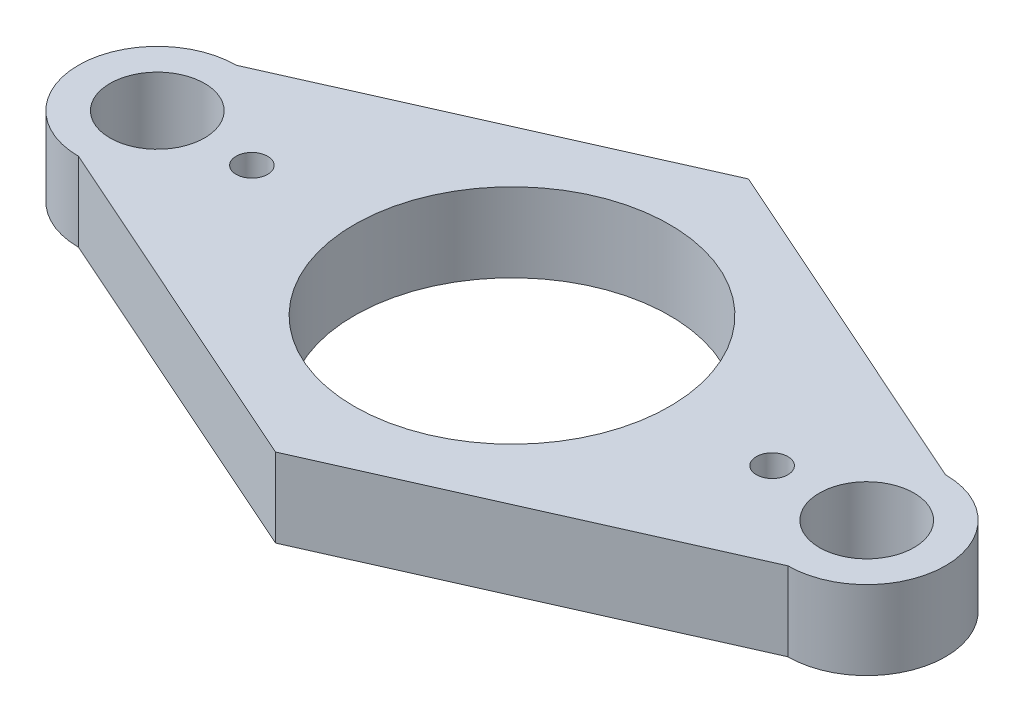
ISO-10303-21;
HEADER;
FILE_DESCRIPTION(('STEP AP214'),'2;1');
FILE_NAME('part.step','',(''),(''),'','','');
FILE_SCHEMA(('AUTOMOTIVE_DESIGN { 1 0 10303 214 1 1 1 1 }'));
ENDSEC;
DATA;
#1=APPLICATION_CONTEXT('core data for automotive mechanical design processes');
#2=APPLICATION_PROTOCOL_DEFINITION('international standard','automotive_design',2000,#1);
#3=PRODUCT_CONTEXT('',#1,'mechanical');
#4=PRODUCT('Part','Part','',(#3));
#5=PRODUCT_RELATED_PRODUCT_CATEGORY('part','',(#4));
#6=PRODUCT_DEFINITION_FORMATION('','',#4);
#7=PRODUCT_DEFINITION_CONTEXT('part definition',#1,'design');
#8=PRODUCT_DEFINITION('design','',#6,#7);
#9=PRODUCT_DEFINITION_SHAPE('','',#8);
#10=(LENGTH_UNIT() NAMED_UNIT(*) SI_UNIT(.MILLI.,.METRE.));
#11=(NAMED_UNIT(*) PLANE_ANGLE_UNIT() SI_UNIT($,.RADIAN.));
#12=(NAMED_UNIT(*) SI_UNIT($,.STERADIAN.) SOLID_ANGLE_UNIT());
#13=UNCERTAINTY_MEASURE_WITH_UNIT(LENGTH_MEASURE(1.E-05),#10,'distance_accuracy_value','');
#14=(GEOMETRIC_REPRESENTATION_CONTEXT(3) GLOBAL_UNCERTAINTY_ASSIGNED_CONTEXT((#13)) GLOBAL_UNIT_ASSIGNED_CONTEXT((#10,
#11,#12)) REPRESENTATION_CONTEXT('',''));
#15=CARTESIAN_POINT('',(0.,0.,0.));
#16=DIRECTION('',(0.,0.,1.));
#17=DIRECTION('',(1.,0.,0.));
#18=AXIS2_PLACEMENT_3D('',#15,#16,#17);
#19=CARTESIAN_POINT('',(22.5,5.,0.869271295597634));
#20=DIRECTION('',(0.,-1.,0.));
#21=DIRECTION('',(0.,0.,-1.));
#22=AXIS2_PLACEMENT_3D('',#19,#20,#21);
#23=CYLINDRICAL_SURFACE('',#22,5.);
#24=CARTESIAN_POINT('',(22.5,0.,0.869271295597634));
#25=DIRECTION('',(0.,1.,0.));
#26=DIRECTION('',(0.,0.,1.));
#27=AXIS2_PLACEMENT_3D('',#24,#25,#26);
#28=CIRCLE('',#27,5.);
#29=CARTESIAN_POINT('',(22.5,0.,-4.13072870440236));
#30=VERTEX_POINT('',#29);
#31=CARTESIAN_POINT('',(22.5,0.,5.86927129559764));
#32=VERTEX_POINT('',#31);
#33=EDGE_CURVE('E135',#30,#32,#28,.F.);
#34=ORIENTED_EDGE('',*,*,#33,.F.);
#35=DIRECTION('',(0.,-1.,0.));
#36=VECTOR('',#35,1.);
#37=CARTESIAN_POINT('',(22.5,5.,-4.13072870440236));
#38=LINE('',#37,#36);
#39=CARTESIAN_POINT('',(22.5,5.,-4.13072870440236));
#40=VERTEX_POINT('',#39);
#41=EDGE_CURVE('E11',#40,#30,#38,.T.);
#42=ORIENTED_EDGE('',*,*,#41,.F.);
#43=CARTESIAN_POINT('',(22.5,5.,0.869271295597634));
#44=DIRECTION('',(0.,1.,0.));
#45=DIRECTION('',(0.,0.,1.));
#46=AXIS2_PLACEMENT_3D('',#43,#44,#45);
#47=CIRCLE('',#46,5.);
#48=CARTESIAN_POINT('',(22.5,5.,5.86927129559764));
#49=VERTEX_POINT('',#48);
#50=EDGE_CURVE('E222',#40,#49,#47,.F.);
#51=ORIENTED_EDGE('',*,*,#50,.T.);
#52=DIRECTION('',(0.,-1.,0.));
#53=VECTOR('',#52,1.);
#54=CARTESIAN_POINT('',(22.5,5.,5.86927129559764));
#55=LINE('',#54,#53);
#56=EDGE_CURVE('E54',#49,#32,#55,.T.);
#57=ORIENTED_EDGE('',*,*,#56,.T.);
#58=EDGE_LOOP('',(#34,#42,#51,#57));
#59=FACE_BOUND('',#58,.T.);
#60=ADVANCED_FACE('F37',(#59),#23,.T.);
#61=CARTESIAN_POINT('',(5.2443941583349,5.,-11.7998868562535));
#62=DIRECTION('',(0.406138466053448,0.,-0.913811548620257));
#63=DIRECTION('',(-0.913811548620257,0.,-0.406138466053448));
#64=AXIS2_PLACEMENT_3D('',#61,#62,#63);
#65=PLANE('',#64);
#66=DIRECTION('',(0.913811548620257,0.,0.406138466053448));
#67=VECTOR('',#66,1.);
#68=CARTESIAN_POINT('',(5.2443941583349,0.,-11.7998868562535));
#69=LINE('',#68,#67);
#70=CARTESIAN_POINT('',(0.,0.,-14.1307287044024));
#71=VERTEX_POINT('',#70);
#72=EDGE_CURVE('E137',#71,#30,#69,.T.);
#73=ORIENTED_EDGE('',*,*,#72,.F.);
#74=DIRECTION('',(0.,-1.,0.));
#75=VECTOR('',#74,1.);
#76=CARTESIAN_POINT('',(0.,5.,-14.1307287044024));
#77=LINE('',#76,#75);
#78=CARTESIAN_POINT('',(0.,5.,-14.1307287044024));
#79=VERTEX_POINT('',#78);
#80=EDGE_CURVE('E46',#79,#71,#77,.T.);
#81=ORIENTED_EDGE('',*,*,#80,.F.);
#82=DIRECTION('',(0.913811548620257,0.,0.406138466053448));
#83=VECTOR('',#82,1.);
#84=CARTESIAN_POINT('',(5.2443941583349,5.,-11.7998868562535));
#85=LINE('',#84,#83);
#86=EDGE_CURVE('E224',#79,#40,#85,.T.);
#87=ORIENTED_EDGE('',*,*,#86,.T.);
#88=ORIENTED_EDGE('',*,*,#41,.T.);
#89=EDGE_LOOP('',(#73,#81,#87,#88));
#90=FACE_BOUND('',#89,.T.);
#91=ADVANCED_FACE('F167',(#90),#65,.T.);
#92=CARTESIAN_POINT('',(-5.2443941583349,5.,-11.7998868562535));
#93=DIRECTION('',(-0.406138466053447,0.,-0.913811548620257));
#94=DIRECTION('',(-0.913811548620257,0.,0.406138466053448));
#95=AXIS2_PLACEMENT_3D('',#92,#93,#94);
#96=PLANE('',#95);
#97=DIRECTION('',(0.913811548620257,0.,-0.406138466053447));
#98=VECTOR('',#97,1.);
#99=CARTESIAN_POINT('',(-5.2443941583349,0.,-11.7998868562535));
#100=LINE('',#99,#98);
#101=CARTESIAN_POINT('',(-22.5,0.,-4.13072870440236));
#102=VERTEX_POINT('',#101);
#103=EDGE_CURVE('E140',#102,#71,#100,.T.);
#104=ORIENTED_EDGE('',*,*,#103,.F.);
#105=DIRECTION('',(0.,-1.,0.));
#106=VECTOR('',#105,1.);
#107=CARTESIAN_POINT('',(-22.5,5.,-4.13072870440236));
#108=LINE('',#107,#106);
#109=CARTESIAN_POINT('',(-22.5,5.,-4.13072870440236));
#110=VERTEX_POINT('',#109);
#111=EDGE_CURVE('E112',#110,#102,#108,.T.);
#112=ORIENTED_EDGE('',*,*,#111,.F.);
#113=DIRECTION('',(0.913811548620257,0.,-0.406138466053447));
#114=VECTOR('',#113,1.);
#115=CARTESIAN_POINT('',(-5.2443941583349,5.,-11.7998868562535));
#116=LINE('',#115,#114);
#117=EDGE_CURVE('E102',#110,#79,#116,.T.);
#118=ORIENTED_EDGE('',*,*,#117,.T.);
#119=ORIENTED_EDGE('',*,*,#80,.T.);
#120=EDGE_LOOP('',(#104,#112,#118,#119));
#121=FACE_BOUND('',#120,.T.);
#122=ADVANCED_FACE('F164',(#121),#96,.T.);
#123=CARTESIAN_POINT('',(-22.5,5.,0.869271295597634));
#124=DIRECTION('',(0.,-1.,0.));
#125=DIRECTION('',(0.,0.,-1.));
#126=AXIS2_PLACEMENT_3D('',#123,#124,#125);
#127=CYLINDRICAL_SURFACE('',#126,5.);
#128=CARTESIAN_POINT('',(-22.5,0.,0.869271295597634));
#129=DIRECTION('',(0.,1.,0.));
#130=DIRECTION('',(0.,0.,1.));
#131=AXIS2_PLACEMENT_3D('',#128,#129,#130);
#132=CIRCLE('',#131,5.);
#133=CARTESIAN_POINT('',(-22.5,0.,5.86927129559763));
#134=VERTEX_POINT('',#133);
#135=EDGE_CURVE('E109',#102,#134,#132,.T.);
#136=ORIENTED_EDGE('',*,*,#135,.T.);
#137=DIRECTION('',(0.,-1.,0.));
#138=VECTOR('',#137,1.);
#139=CARTESIAN_POINT('',(-22.5,5.,5.86927129559763));
#140=LINE('',#139,#138);
#141=CARTESIAN_POINT('',(-22.5,5.,5.86927129559763));
#142=VERTEX_POINT('',#141);
#143=EDGE_CURVE('E106',#142,#134,#140,.T.);
#144=ORIENTED_EDGE('',*,*,#143,.F.);
#145=CARTESIAN_POINT('',(-22.5,5.,0.869271295597634));
#146=DIRECTION('',(0.,1.,0.));
#147=DIRECTION('',(0.,0.,1.));
#148=AXIS2_PLACEMENT_3D('',#145,#146,#147);
#149=CIRCLE('',#148,5.);
#150=EDGE_CURVE('E93',#110,#142,#149,.T.);
#151=ORIENTED_EDGE('',*,*,#150,.F.);
#152=ORIENTED_EDGE('',*,*,#111,.T.);
#153=EDGE_LOOP('',(#136,#144,#151,#152));
#154=FACE_BOUND('',#153,.T.);
#155=ADVANCED_FACE('F107',(#154),#127,.T.);
#156=CARTESIAN_POINT('',(-5.8896264602218,5.,13.251659535499));
#157=DIRECTION('',(-0.406138466053447,0.,0.913811548620257));
#158=DIRECTION('',(0.913811548620257,0.,0.406138466053448));
#159=AXIS2_PLACEMENT_3D('',#156,#157,#158);
#160=PLANE('',#159);
#161=DIRECTION('',(-0.913811548620257,0.,-0.406138466053447));
#162=VECTOR('',#161,1.);
#163=CARTESIAN_POINT('',(-5.8896264602218,0.,13.251659535499));
#164=LINE('',#163,#162);
#165=CARTESIAN_POINT('',(0.,0.,15.8692712955976));
#166=VERTEX_POINT('',#165);
#167=EDGE_CURVE('E144',#166,#134,#164,.T.);
#168=ORIENTED_EDGE('',*,*,#167,.F.);
#169=DIRECTION('',(0.,-1.,0.));
#170=VECTOR('',#169,1.);
#171=CARTESIAN_POINT('',(0.,5.,15.8692712955976));
#172=LINE('',#171,#170);
#173=CARTESIAN_POINT('',(0.,5.,15.8692712955976));
#174=VERTEX_POINT('',#173);
#175=EDGE_CURVE('E73',#174,#166,#172,.T.);
#176=ORIENTED_EDGE('',*,*,#175,.F.);
#177=DIRECTION('',(-0.913811548620257,0.,-0.406138466053447));
#178=VECTOR('',#177,1.);
#179=CARTESIAN_POINT('',(-5.8896264602218,5.,13.251659535499));
#180=LINE('',#179,#178);
#181=EDGE_CURVE('E99',#174,#142,#180,.T.);
#182=ORIENTED_EDGE('',*,*,#181,.T.);
#183=ORIENTED_EDGE('',*,*,#143,.T.);
#184=EDGE_LOOP('',(#168,#176,#182,#183));
#185=FACE_BOUND('',#184,.T.);
#186=ADVANCED_FACE('F114',(#185),#160,.T.);
#187=CARTESIAN_POINT('',(0.,5.,0.869271295597634));
#188=DIRECTION('',(0.,-1.,0.));
#189=DIRECTION('',(0.,0.,-1.));
#190=AXIS2_PLACEMENT_3D('',#187,#188,#189);
#191=CYLINDRICAL_SURFACE('',#190,10.);
#192=CARTESIAN_POINT('',(0.,5.,0.869271295597634));
#193=DIRECTION('',(0.,1.,0.));
#194=DIRECTION('',(0.,0.,1.));
#195=AXIS2_PLACEMENT_3D('',#192,#193,#194);
#196=CIRCLE('',#195,10.);
#197=CARTESIAN_POINT('',(0.,5.,10.8692712955976));
#198=VERTEX_POINT('',#197);
#199=EDGE_CURVE('E123',#198,#198,#196,.T.);
#200=ORIENTED_EDGE('',*,*,#199,.T.);
#201=EDGE_LOOP('',(#200));
#202=FACE_BOUND('',#201,.T.);
#203=CARTESIAN_POINT('',(0.,0.,0.869271295597634));
#204=DIRECTION('',(0.,1.,0.));
#205=DIRECTION('',(0.,0.,1.));
#206=AXIS2_PLACEMENT_3D('',#203,#204,#205);
#207=CIRCLE('',#206,10.);
#208=CARTESIAN_POINT('',(0.,0.,10.8692712955976));
#209=VERTEX_POINT('',#208);
#210=EDGE_CURVE('E152',#209,#209,#207,.T.);
#211=ORIENTED_EDGE('',*,*,#210,.F.);
#212=EDGE_LOOP('',(#211));
#213=FACE_BOUND('',#212,.T.);
#214=ADVANCED_FACE('F181',(#202,#213),#191,.F.);
#215=CARTESIAN_POINT('',(22.5,5.,0.869271295597634));
#216=DIRECTION('',(0.,-1.,0.));
#217=DIRECTION('',(0.,0.,-1.));
#218=AXIS2_PLACEMENT_3D('',#215,#216,#217);
#219=CYLINDRICAL_SURFACE('',#218,2.99999999999999);
#220=CARTESIAN_POINT('',(22.5,5.,0.869271295597634));
#221=DIRECTION('',(0.,1.,0.));
#222=DIRECTION('',(0.,0.,1.));
#223=AXIS2_PLACEMENT_3D('',#220,#221,#222);
#224=CIRCLE('',#223,2.99999999999999);
#225=CARTESIAN_POINT('',(22.5,5.,3.86927129559763));
#226=VERTEX_POINT('',#225);
#227=EDGE_CURVE('E117',#226,#226,#224,.T.);
#228=ORIENTED_EDGE('',*,*,#227,.T.);
#229=EDGE_LOOP('',(#228));
#230=FACE_BOUND('',#229,.T.);
#231=CARTESIAN_POINT('',(22.5,0.,0.869271295597634));
#232=DIRECTION('',(0.,1.,0.));
#233=DIRECTION('',(0.,0.,1.));
#234=AXIS2_PLACEMENT_3D('',#231,#232,#233);
#235=CIRCLE('',#234,2.99999999999999);
#236=CARTESIAN_POINT('',(22.5,0.,3.86927129559763));
#237=VERTEX_POINT('',#236);
#238=EDGE_CURVE('E149',#237,#237,#235,.T.);
#239=ORIENTED_EDGE('',*,*,#238,.F.);
#240=EDGE_LOOP('',(#239));
#241=FACE_BOUND('',#240,.T.);
#242=ADVANCED_FACE('F174',(#230,#241),#219,.F.);
#243=CARTESIAN_POINT('',(5.88962646022181,5.,13.2516595354991));
#244=DIRECTION('',(0.406138466053448,0.,0.913811548620257));
#245=DIRECTION('',(0.913811548620257,0.,-0.406138466053448));
#246=AXIS2_PLACEMENT_3D('',#243,#244,#245);
#247=PLANE('',#246);
#248=DIRECTION('',(-0.913811548620257,0.,0.406138466053448));
#249=VECTOR('',#248,1.);
#250=CARTESIAN_POINT('',(5.88962646022181,0.,13.2516595354991));
#251=LINE('',#250,#249);
#252=EDGE_CURVE('E146',#32,#166,#251,.T.);
#253=ORIENTED_EDGE('',*,*,#252,.F.);
#254=ORIENTED_EDGE('',*,*,#56,.F.);
#255=DIRECTION('',(-0.913811548620257,0.,0.406138466053448));
#256=VECTOR('',#255,1.);
#257=CARTESIAN_POINT('',(5.88962646022181,5.,13.2516595354991));
#258=LINE('',#257,#256);
#259=EDGE_CURVE('E115',#49,#174,#258,.T.);
#260=ORIENTED_EDGE('',*,*,#259,.T.);
#261=ORIENTED_EDGE('',*,*,#175,.T.);
#262=EDGE_LOOP('',(#253,#254,#260,#261));
#263=FACE_BOUND('',#262,.T.);
#264=ADVANCED_FACE('F171',(#263),#247,.T.);
#265=CARTESIAN_POINT('',(-16.5,5.,0.869271295597634));
#266=DIRECTION('',(0.,-1.,0.));
#267=DIRECTION('',(0.,0.,-1.));
#268=AXIS2_PLACEMENT_3D('',#265,#266,#267);
#269=CYLINDRICAL_SURFACE('',#268,1.);
#270=CARTESIAN_POINT('',(-16.5,5.,0.869271295597634));
#271=DIRECTION('',(0.,1.,0.));
#272=DIRECTION('',(0.,0.,1.));
#273=AXIS2_PLACEMENT_3D('',#270,#271,#272);
#274=CIRCLE('',#273,1.);
#275=CARTESIAN_POINT('',(-16.5,5.,1.86927129559764));
#276=VERTEX_POINT('',#275);
#277=EDGE_CURVE('E221',#276,#276,#274,.T.);
#278=ORIENTED_EDGE('',*,*,#277,.T.);
#279=EDGE_LOOP('',(#278));
#280=FACE_BOUND('',#279,.T.);
#281=CARTESIAN_POINT('',(-16.5,0.,0.869271295597634));
#282=DIRECTION('',(0.,1.,0.));
#283=DIRECTION('',(0.,0.,1.));
#284=AXIS2_PLACEMENT_3D('',#281,#282,#283);
#285=CIRCLE('',#284,1.);
#286=CARTESIAN_POINT('',(-16.5,0.,1.86927129559764));
#287=VERTEX_POINT('',#286);
#288=EDGE_CURVE('E132',#287,#287,#285,.T.);
#289=ORIENTED_EDGE('',*,*,#288,.F.);
#290=EDGE_LOOP('',(#289));
#291=FACE_BOUND('',#290,.T.);
#292=ADVANCED_FACE('F173',(#280,#291),#269,.F.);
#293=CARTESIAN_POINT('',(16.5,5.,0.869271295597634));
#294=DIRECTION('',(0.,-1.,0.));
#295=DIRECTION('',(0.,0.,-1.));
#296=AXIS2_PLACEMENT_3D('',#293,#294,#295);
#297=CYLINDRICAL_SURFACE('',#296,1.);
#298=CARTESIAN_POINT('',(16.5,5.,0.869271295597634));
#299=DIRECTION('',(0.,1.,0.));
#300=DIRECTION('',(0.,0.,1.));
#301=AXIS2_PLACEMENT_3D('',#298,#299,#300);
#302=CIRCLE('',#301,1.);
#303=CARTESIAN_POINT('',(16.5,5.,1.86927129559764));
#304=VERTEX_POINT('',#303);
#305=EDGE_CURVE('E158',#304,#304,#302,.T.);
#306=ORIENTED_EDGE('',*,*,#305,.T.);
#307=EDGE_LOOP('',(#306));
#308=FACE_BOUND('',#307,.T.);
#309=CARTESIAN_POINT('',(16.5,0.,0.869271295597634));
#310=DIRECTION('',(0.,1.,0.));
#311=DIRECTION('',(0.,0.,1.));
#312=AXIS2_PLACEMENT_3D('',#309,#310,#311);
#313=CIRCLE('',#312,1.);
#314=CARTESIAN_POINT('',(16.5,0.,1.86927129559764));
#315=VERTEX_POINT('',#314);
#316=EDGE_CURVE('E129',#315,#315,#313,.T.);
#317=ORIENTED_EDGE('',*,*,#316,.F.);
#318=EDGE_LOOP('',(#317));
#319=FACE_BOUND('',#318,.T.);
#320=ADVANCED_FACE('F39',(#308,#319),#297,.F.);
#321=CARTESIAN_POINT('',(-22.5,5.,0.869271295597634));
#322=DIRECTION('',(0.,-1.,0.));
#323=DIRECTION('',(0.,0.,-1.));
#324=AXIS2_PLACEMENT_3D('',#321,#322,#323);
#325=CYLINDRICAL_SURFACE('',#324,3.);
#326=CARTESIAN_POINT('',(-22.5,5.,0.869271295597634));
#327=DIRECTION('',(0.,1.,0.));
#328=DIRECTION('',(0.,0.,1.));
#329=AXIS2_PLACEMENT_3D('',#326,#327,#328);
#330=CIRCLE('',#329,3.);
#331=CARTESIAN_POINT('',(-22.5,5.,3.86927129559764));
#332=VERTEX_POINT('',#331);
#333=EDGE_CURVE('E126',#332,#332,#330,.T.);
#334=ORIENTED_EDGE('',*,*,#333,.T.);
#335=EDGE_LOOP('',(#334));
#336=FACE_BOUND('',#335,.T.);
#337=CARTESIAN_POINT('',(-22.5,0.,0.869271295597634));
#338=DIRECTION('',(0.,1.,0.));
#339=DIRECTION('',(0.,0.,1.));
#340=AXIS2_PLACEMENT_3D('',#337,#338,#339);
#341=CIRCLE('',#340,3.);
#342=CARTESIAN_POINT('',(-22.5,0.,3.86927129559764));
#343=VERTEX_POINT('',#342);
#344=EDGE_CURVE('E155',#343,#343,#341,.T.);
#345=ORIENTED_EDGE('',*,*,#344,.F.);
#346=EDGE_LOOP('',(#345));
#347=FACE_BOUND('',#346,.T.);
#348=ADVANCED_FACE('F205',(#336,#347),#325,.F.);
#349=CARTESIAN_POINT('',(0.,5.,0.));
#350=DIRECTION('',(0.,1.,0.));
#351=DIRECTION('',(0.,0.,1.));
#352=AXIS2_PLACEMENT_3D('',#349,#350,#351);
#353=PLANE('',#352);
#354=ORIENTED_EDGE('',*,*,#305,.F.);
#355=EDGE_LOOP('',(#354));
#356=FACE_BOUND('',#355,.T.);
#357=ORIENTED_EDGE('',*,*,#277,.F.);
#358=EDGE_LOOP('',(#357));
#359=FACE_BOUND('',#358,.T.);
#360=ORIENTED_EDGE('',*,*,#50,.F.);
#361=ORIENTED_EDGE('',*,*,#86,.F.);
#362=ORIENTED_EDGE('',*,*,#117,.F.);
#363=ORIENTED_EDGE('',*,*,#150,.T.);
#364=ORIENTED_EDGE('',*,*,#181,.F.);
#365=ORIENTED_EDGE('',*,*,#259,.F.);
#366=EDGE_LOOP('',(#360,#361,#362,#363,#364,#365));
#367=FACE_BOUND('',#366,.T.);
#368=ORIENTED_EDGE('',*,*,#227,.F.);
#369=EDGE_LOOP('',(#368));
#370=FACE_BOUND('',#369,.T.);
#371=ORIENTED_EDGE('',*,*,#199,.F.);
#372=EDGE_LOOP('',(#371));
#373=FACE_BOUND('',#372,.T.);
#374=ORIENTED_EDGE('',*,*,#333,.F.);
#375=EDGE_LOOP('',(#374));
#376=FACE_BOUND('',#375,.T.);
#377=ADVANCED_FACE('F95',(#356,#359,#367,#370,#373,#376),#353,.T.);
#378=CARTESIAN_POINT('',(0.,0.,0.));
#379=DIRECTION('',(0.,1.,0.));
#380=DIRECTION('',(0.,0.,1.));
#381=AXIS2_PLACEMENT_3D('',#378,#379,#380);
#382=PLANE('',#381);
#383=ORIENTED_EDGE('',*,*,#316,.T.);
#384=EDGE_LOOP('',(#383));
#385=FACE_BOUND('',#384,.T.);
#386=ORIENTED_EDGE('',*,*,#288,.T.);
#387=EDGE_LOOP('',(#386));
#388=FACE_BOUND('',#387,.T.);
#389=ORIENTED_EDGE('',*,*,#33,.T.);
#390=ORIENTED_EDGE('',*,*,#252,.T.);
#391=ORIENTED_EDGE('',*,*,#167,.T.);
#392=ORIENTED_EDGE('',*,*,#135,.F.);
#393=ORIENTED_EDGE('',*,*,#103,.T.);
#394=ORIENTED_EDGE('',*,*,#72,.T.);
#395=EDGE_LOOP('',(#389,#390,#391,#392,#393,#394));
#396=FACE_BOUND('',#395,.T.);
#397=ORIENTED_EDGE('',*,*,#238,.T.);
#398=EDGE_LOOP('',(#397));
#399=FACE_BOUND('',#398,.T.);
#400=ORIENTED_EDGE('',*,*,#210,.T.);
#401=EDGE_LOOP('',(#400));
#402=FACE_BOUND('',#401,.T.);
#403=ORIENTED_EDGE('',*,*,#344,.T.);
#404=EDGE_LOOP('',(#403));
#405=FACE_BOUND('',#404,.T.);
#406=ADVANCED_FACE('F169',(#385,#388,#396,#399,#402,#405),#382,.F.);
#407=CLOSED_SHELL('',(#60,#91,#122,#155,#186,#214,#242,#264,#292,#320,#348,#377,#406));
#408=MANIFOLD_SOLID_BREP('B2',#407);
#409=ADVANCED_BREP_SHAPE_REPRESENTATION('',(#18,#408),#14);
#410=SHAPE_DEFINITION_REPRESENTATION(#9,#409);
ENDSEC;
END-ISO-10303-21;
